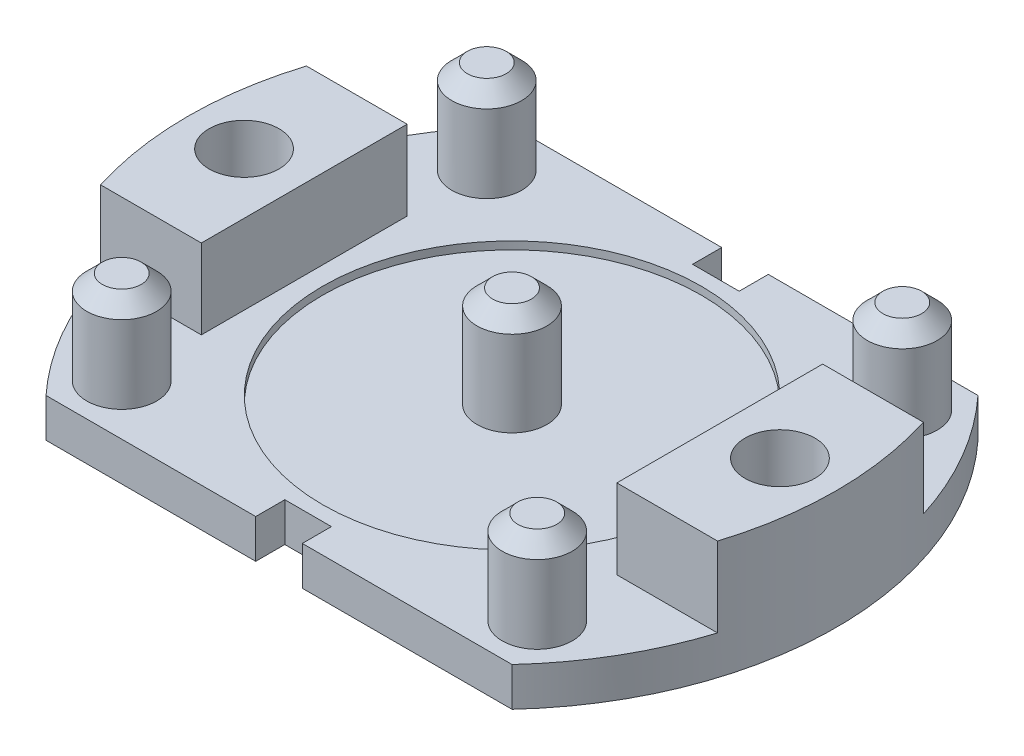
ISO-10303-21;
HEADER;
FILE_DESCRIPTION(('STEP AP214'),'2;1');
FILE_NAME('part.step','',(''),(''),'','','');
FILE_SCHEMA(('AUTOMOTIVE_DESIGN { 1 0 10303 214 1 1 1 1 }'));
ENDSEC;
DATA;
#1=APPLICATION_CONTEXT('core data for automotive mechanical design processes');
#2=APPLICATION_PROTOCOL_DEFINITION('international standard','automotive_design',2000,#1);
#3=PRODUCT_CONTEXT('',#1,'mechanical');
#4=PRODUCT('Part','Part','',(#3));
#5=PRODUCT_RELATED_PRODUCT_CATEGORY('part','',(#4));
#6=PRODUCT_DEFINITION_FORMATION('','',#4);
#7=PRODUCT_DEFINITION_CONTEXT('part definition',#1,'design');
#8=PRODUCT_DEFINITION('design','',#6,#7);
#9=PRODUCT_DEFINITION_SHAPE('','',#8);
#10=(LENGTH_UNIT() NAMED_UNIT(*) SI_UNIT(.MILLI.,.METRE.));
#11=(NAMED_UNIT(*) PLANE_ANGLE_UNIT() SI_UNIT($,.RADIAN.));
#12=(NAMED_UNIT(*) SI_UNIT($,.STERADIAN.) SOLID_ANGLE_UNIT());
#13=UNCERTAINTY_MEASURE_WITH_UNIT(LENGTH_MEASURE(1.E-05),#10,'distance_accuracy_value','');
#14=(GEOMETRIC_REPRESENTATION_CONTEXT(3) GLOBAL_UNCERTAINTY_ASSIGNED_CONTEXT((#13)) GLOBAL_UNIT_ASSIGNED_CONTEXT((#10,
#11,#12)) REPRESENTATION_CONTEXT('',''));
#15=CARTESIAN_POINT('',(0.,0.,0.));
#16=DIRECTION('',(0.,0.,1.));
#17=DIRECTION('',(1.,0.,0.));
#18=AXIS2_PLACEMENT_3D('',#15,#16,#17);
#19=CARTESIAN_POINT('',(0.48457447,1.,0.));
#20=DIRECTION('',(0.,-1.,0.));
#21=DIRECTION('',(0.,0.,-1.));
#22=AXIS2_PLACEMENT_3D('',#19,#20,#21);
#23=CYLINDRICAL_SURFACE('',#22,8.83457446949064);
#24=CARTESIAN_POINT('',(0.48457447,3.05,0.));
#25=DIRECTION('',(0.,1.,0.));
#26=DIRECTION('',(0.,0.,1.));
#27=AXIS2_PLACEMENT_3D('',#24,#25,#26);
#28=CIRCLE('',#27,8.83457446949064);
#29=CARTESIAN_POINT('',(-7.94318953102517,3.05,-2.65));
#30=VERTEX_POINT('',#29);
#31=CARTESIAN_POINT('',(-7.94318953102517,3.05,2.65));
#32=VERTEX_POINT('',#31);
#33=EDGE_CURVE('E202',#30,#32,#28,.T.);
#34=ORIENTED_EDGE('',*,*,#33,.F.);
#35=DIRECTION('',(0.,-1.,0.));
#36=VECTOR('',#35,1.);
#37=CARTESIAN_POINT('',(-7.94318953102517,3.4,-2.65));
#38=LINE('',#37,#36);
#39=CARTESIAN_POINT('',(-7.94318953102517,1.,-2.65));
#40=VERTEX_POINT('',#39);
#41=EDGE_CURVE('E200',#30,#40,#38,.T.);
#42=ORIENTED_EDGE('',*,*,#41,.T.);
#43=CARTESIAN_POINT('',(0.48457447,1.,0.));
#44=DIRECTION('',(0.,1.,0.));
#45=DIRECTION('',(0.,0.,1.));
#46=AXIS2_PLACEMENT_3D('',#43,#44,#45);
#47=CIRCLE('',#46,8.83457446949064);
#48=CARTESIAN_POINT('',(-5.99999999981541,1.,-6.0000000001995));
#49=VERTEX_POINT('',#48);
#50=EDGE_CURVE('E289',#49,#40,#47,.T.);
#51=ORIENTED_EDGE('',*,*,#50,.F.);
#52=DIRECTION('',(0.,-1.,0.));
#53=VECTOR('',#52,1.);
#54=CARTESIAN_POINT('',(-5.99999999981541,1.,-6.0000000001995));
#55=LINE('',#54,#53);
#56=CARTESIAN_POINT('',(-5.99999999981541,0.,-6.0000000001995));
#57=VERTEX_POINT('',#56);
#58=EDGE_CURVE('E404',#49,#57,#55,.T.);
#59=ORIENTED_EDGE('',*,*,#58,.T.);
#60=CARTESIAN_POINT('',(0.48457447,0.,0.));
#61=DIRECTION('',(0.,1.,0.));
#62=DIRECTION('',(0.,0.,1.));
#63=AXIS2_PLACEMENT_3D('',#60,#61,#62);
#64=CIRCLE('',#63,8.83457446949064);
#65=CARTESIAN_POINT('',(-6.,0.,6.));
#66=VERTEX_POINT('',#65);
#67=EDGE_CURVE('E329',#57,#66,#64,.T.);
#68=ORIENTED_EDGE('',*,*,#67,.T.);
#69=DIRECTION('',(0.,-1.,0.));
#70=VECTOR('',#69,1.);
#71=CARTESIAN_POINT('',(-6.,1.,6.));
#72=LINE('',#71,#70);
#73=CARTESIAN_POINT('',(-6.,1.,6.));
#74=VERTEX_POINT('',#73);
#75=EDGE_CURVE('E400',#74,#66,#72,.T.);
#76=ORIENTED_EDGE('',*,*,#75,.F.);
#77=CARTESIAN_POINT('',(-7.94318953102517,1.,2.65));
#78=VERTEX_POINT('',#77);
#79=EDGE_CURVE('E287',#78,#74,#47,.T.);
#80=ORIENTED_EDGE('',*,*,#79,.F.);
#81=DIRECTION('',(0.,-1.,0.));
#82=VECTOR('',#81,1.);
#83=CARTESIAN_POINT('',(-7.94318953102517,3.4,2.65));
#84=LINE('',#83,#82);
#85=EDGE_CURVE('E215',#32,#78,#84,.T.);
#86=ORIENTED_EDGE('',*,*,#85,.F.);
#87=EDGE_LOOP('',(#34,#42,#51,#59,#68,#76,#80,#86));
#88=FACE_BOUND('',#87,.T.);
#89=ADVANCED_FACE('F44',(#88),#23,.T.);
#90=CARTESIAN_POINT('',(-0.484574470509366,1.,0.));
#91=DIRECTION('',(0.,-1.,0.));
#92=DIRECTION('',(0.,0.,-1.));
#93=AXIS2_PLACEMENT_3D('',#90,#91,#92);
#94=CYLINDRICAL_SURFACE('',#93,8.83457447);
#95=CARTESIAN_POINT('',(-0.484574470509366,3.05,0.));
#96=DIRECTION('',(0.,1.,0.));
#97=DIRECTION('',(0.,0.,1.));
#98=AXIS2_PLACEMENT_3D('',#95,#96,#97);
#99=CIRCLE('',#98,8.83457447);
#100=CARTESIAN_POINT('',(7.94318953104976,3.05,2.65));
#101=VERTEX_POINT('',#100);
#102=CARTESIAN_POINT('',(7.94318953104976,3.05,-2.65));
#103=VERTEX_POINT('',#102);
#104=EDGE_CURVE('E458',#101,#103,#99,.T.);
#105=ORIENTED_EDGE('',*,*,#104,.F.);
#106=DIRECTION('',(0.,-1.,0.));
#107=VECTOR('',#106,1.);
#108=CARTESIAN_POINT('',(7.94318953104976,3.4,2.65));
#109=LINE('',#108,#107);
#110=CARTESIAN_POINT('',(7.94318953104976,1.,2.65));
#111=VERTEX_POINT('',#110);
#112=EDGE_CURVE('E232',#101,#111,#109,.T.);
#113=ORIENTED_EDGE('',*,*,#112,.T.);
#114=CARTESIAN_POINT('',(-0.484574470509366,1.,0.));
#115=DIRECTION('',(0.,1.,0.));
#116=DIRECTION('',(0.,0.,1.));
#117=AXIS2_PLACEMENT_3D('',#114,#115,#116);
#118=CIRCLE('',#117,8.83457447);
#119=CARTESIAN_POINT('',(6.,1.,6.0000000001995));
#120=VERTEX_POINT('',#119);
#121=EDGE_CURVE('E309',#120,#111,#118,.T.);
#122=ORIENTED_EDGE('',*,*,#121,.F.);
#123=DIRECTION('',(0.,-1.,0.));
#124=VECTOR('',#123,1.);
#125=CARTESIAN_POINT('',(6.,1.,6.0000000001995));
#126=LINE('',#125,#124);
#127=CARTESIAN_POINT('',(6.,0.,6.0000000001995));
#128=VERTEX_POINT('',#127);
#129=EDGE_CURVE('E380',#120,#128,#126,.T.);
#130=ORIENTED_EDGE('',*,*,#129,.T.);
#131=CARTESIAN_POINT('',(-0.484574470509366,0.,0.));
#132=DIRECTION('',(0.,1.,0.));
#133=DIRECTION('',(0.,0.,1.));
#134=AXIS2_PLACEMENT_3D('',#131,#132,#133);
#135=CIRCLE('',#134,8.83457447);
#136=CARTESIAN_POINT('',(6.00000000018459,0.,-6.));
#137=VERTEX_POINT('',#136);
#138=EDGE_CURVE('E347',#128,#137,#135,.T.);
#139=ORIENTED_EDGE('',*,*,#138,.T.);
#140=DIRECTION('',(0.,-1.,0.));
#141=VECTOR('',#140,1.);
#142=CARTESIAN_POINT('',(6.00000000018459,1.,-6.));
#143=LINE('',#142,#141);
#144=CARTESIAN_POINT('',(6.00000000018459,1.,-6.));
#145=VERTEX_POINT('',#144);
#146=EDGE_CURVE('E376',#145,#137,#143,.T.);
#147=ORIENTED_EDGE('',*,*,#146,.F.);
#148=CARTESIAN_POINT('',(7.94318953104976,1.,-2.65));
#149=VERTEX_POINT('',#148);
#150=EDGE_CURVE('E308',#149,#145,#118,.T.);
#151=ORIENTED_EDGE('',*,*,#150,.F.);
#152=DIRECTION('',(0.,-1.,0.));
#153=VECTOR('',#152,1.);
#154=CARTESIAN_POINT('',(7.94318953104976,3.4,-2.65));
#155=LINE('',#154,#153);
#156=EDGE_CURVE('E240',#103,#149,#155,.T.);
#157=ORIENTED_EDGE('',*,*,#156,.F.);
#158=EDGE_LOOP('',(#105,#113,#122,#130,#139,#147,#151,#157));
#159=FACE_BOUND('',#158,.T.);
#160=ADVANCED_FACE('F489',(#159),#94,.T.);
#161=CARTESIAN_POINT('',(5.35,3.4,2.65));
#162=DIRECTION('',(0.,0.,1.));
#163=DIRECTION('',(1.,0.,0.));
#164=AXIS2_PLACEMENT_3D('',#161,#162,#163);
#165=PLANE('',#164);
#166=ORIENTED_EDGE('',*,*,#112,.F.);
#167=DIRECTION('',(1.,0.,0.));
#168=VECTOR('',#167,1.);
#169=CARTESIAN_POINT('',(5.35,3.05,2.65));
#170=LINE('',#169,#168);
#171=CARTESIAN_POINT('',(5.35,3.05,2.65));
#172=VERTEX_POINT('',#171);
#173=EDGE_CURVE('E461',#172,#101,#170,.T.);
#174=ORIENTED_EDGE('',*,*,#173,.F.);
#175=DIRECTION('',(0.,-1.,0.));
#176=VECTOR('',#175,1.);
#177=CARTESIAN_POINT('',(5.35,3.4,2.65));
#178=LINE('',#177,#176);
#179=CARTESIAN_POINT('',(5.35,1.,2.65));
#180=VERTEX_POINT('',#179);
#181=EDGE_CURVE('E233',#172,#180,#178,.T.);
#182=ORIENTED_EDGE('',*,*,#181,.T.);
#183=DIRECTION('',(1.,0.,0.));
#184=VECTOR('',#183,1.);
#185=CARTESIAN_POINT('',(0.48457447,1.,2.65));
#186=LINE('',#185,#184);
#187=EDGE_CURVE('E252',#180,#111,#186,.T.);
#188=ORIENTED_EDGE('',*,*,#187,.T.);
#189=EDGE_LOOP('',(#166,#174,#182,#188));
#190=FACE_BOUND('',#189,.T.);
#191=ADVANCED_FACE('F495',(#190),#165,.T.);
#192=CARTESIAN_POINT('',(5.35,3.4,-2.65));
#193=DIRECTION('',(0.,0.,-1.));
#194=DIRECTION('',(-1.,0.,0.));
#195=AXIS2_PLACEMENT_3D('',#192,#193,#194);
#196=PLANE('',#195);
#197=DIRECTION('',(0.,-1.,0.));
#198=VECTOR('',#197,1.);
#199=CARTESIAN_POINT('',(5.35,3.4,-2.65));
#200=LINE('',#199,#198);
#201=CARTESIAN_POINT('',(5.35,3.05,-2.65));
#202=VERTEX_POINT('',#201);
#203=CARTESIAN_POINT('',(5.35,1.,-2.65));
#204=VERTEX_POINT('',#203);
#205=EDGE_CURVE('E237',#202,#204,#200,.T.);
#206=ORIENTED_EDGE('',*,*,#205,.F.);
#207=DIRECTION('',(-1.,0.,0.));
#208=VECTOR('',#207,1.);
#209=CARTESIAN_POINT('',(7.94318953104976,3.05,-2.65));
#210=LINE('',#209,#208);
#211=EDGE_CURVE('E63',#103,#202,#210,.T.);
#212=ORIENTED_EDGE('',*,*,#211,.F.);
#213=ORIENTED_EDGE('',*,*,#156,.T.);
#214=DIRECTION('',(-1.,0.,0.));
#215=VECTOR('',#214,1.);
#216=CARTESIAN_POINT('',(0.48457447,1.,-2.65));
#217=LINE('',#216,#215);
#218=EDGE_CURVE('E248',#149,#204,#217,.T.);
#219=ORIENTED_EDGE('',*,*,#218,.T.);
#220=EDGE_LOOP('',(#206,#212,#213,#219));
#221=FACE_BOUND('',#220,.T.);
#222=ADVANCED_FACE('F663',(#221),#196,.T.);
#223=CARTESIAN_POINT('',(5.35,3.4,2.65));
#224=DIRECTION('',(-1.,0.,0.));
#225=DIRECTION('',(0.,0.,1.));
#226=AXIS2_PLACEMENT_3D('',#223,#224,#225);
#227=PLANE('',#226);
#228=ORIENTED_EDGE('',*,*,#181,.F.);
#229=DIRECTION('',(0.,0.,1.));
#230=VECTOR('',#229,1.);
#231=CARTESIAN_POINT('',(5.35,3.05,-2.65));
#232=LINE('',#231,#230);
#233=EDGE_CURVE('E192',#202,#172,#232,.T.);
#234=ORIENTED_EDGE('',*,*,#233,.F.);
#235=ORIENTED_EDGE('',*,*,#205,.T.);
#236=DIRECTION('',(0.,0.,1.));
#237=VECTOR('',#236,1.);
#238=CARTESIAN_POINT('',(5.35,1.,0.));
#239=LINE('',#238,#237);
#240=EDGE_CURVE('E236',#204,#180,#239,.T.);
#241=ORIENTED_EDGE('',*,*,#240,.T.);
#242=EDGE_LOOP('',(#228,#234,#235,#241));
#243=FACE_BOUND('',#242,.T.);
#244=ADVANCED_FACE('F660',(#243),#227,.T.);
#245=CARTESIAN_POINT('',(-5.35,3.4,-2.65));
#246=DIRECTION('',(0.,0.,-1.));
#247=DIRECTION('',(-1.,0.,0.));
#248=AXIS2_PLACEMENT_3D('',#245,#246,#247);
#249=PLANE('',#248);
#250=ORIENTED_EDGE('',*,*,#41,.F.);
#251=DIRECTION('',(-1.,0.,0.));
#252=VECTOR('',#251,1.);
#253=CARTESIAN_POINT('',(-5.35,3.05,-2.65));
#254=LINE('',#253,#252);
#255=CARTESIAN_POINT('',(-5.35,3.05,-2.65));
#256=VERTEX_POINT('',#255);
#257=EDGE_CURVE('E186',#256,#30,#254,.T.);
#258=ORIENTED_EDGE('',*,*,#257,.F.);
#259=DIRECTION('',(0.,-1.,0.));
#260=VECTOR('',#259,1.);
#261=CARTESIAN_POINT('',(-5.35,3.4,-2.65));
#262=LINE('',#261,#260);
#263=CARTESIAN_POINT('',(-5.35,1.,-2.65));
#264=VERTEX_POINT('',#263);
#265=EDGE_CURVE('E198',#256,#264,#262,.T.);
#266=ORIENTED_EDGE('',*,*,#265,.T.);
#267=DIRECTION('',(-1.,0.,0.));
#268=VECTOR('',#267,1.);
#269=CARTESIAN_POINT('',(0.48457447,1.,-2.65));
#270=LINE('',#269,#268);
#271=EDGE_CURVE('E229',#264,#40,#270,.T.);
#272=ORIENTED_EDGE('',*,*,#271,.T.);
#273=EDGE_LOOP('',(#250,#258,#266,#272));
#274=FACE_BOUND('',#273,.T.);
#275=ADVANCED_FACE('F196',(#274),#249,.T.);
#276=CARTESIAN_POINT('',(-5.35,3.4,2.65));
#277=DIRECTION('',(0.,0.,1.));
#278=DIRECTION('',(1.,0.,0.));
#279=AXIS2_PLACEMENT_3D('',#276,#277,#278);
#280=PLANE('',#279);
#281=DIRECTION('',(0.,-1.,0.));
#282=VECTOR('',#281,1.);
#283=CARTESIAN_POINT('',(-5.35,3.4,2.65));
#284=LINE('',#283,#282);
#285=CARTESIAN_POINT('',(-5.35,3.05,2.65));
#286=VERTEX_POINT('',#285);
#287=CARTESIAN_POINT('',(-5.35,1.,2.65));
#288=VERTEX_POINT('',#287);
#289=EDGE_CURVE('E209',#286,#288,#284,.T.);
#290=ORIENTED_EDGE('',*,*,#289,.F.);
#291=DIRECTION('',(1.,0.,0.));
#292=VECTOR('',#291,1.);
#293=CARTESIAN_POINT('',(-7.94318953102517,3.05,2.65));
#294=LINE('',#293,#292);
#295=EDGE_CURVE('E71',#32,#286,#294,.T.);
#296=ORIENTED_EDGE('',*,*,#295,.F.);
#297=ORIENTED_EDGE('',*,*,#85,.T.);
#298=DIRECTION('',(1.,0.,0.));
#299=VECTOR('',#298,1.);
#300=CARTESIAN_POINT('',(0.48457447,1.,2.65));
#301=LINE('',#300,#299);
#302=EDGE_CURVE('E213',#78,#288,#301,.T.);
#303=ORIENTED_EDGE('',*,*,#302,.T.);
#304=EDGE_LOOP('',(#290,#296,#297,#303));
#305=FACE_BOUND('',#304,.T.);
#306=ADVANCED_FACE('F667',(#305),#280,.T.);
#307=CARTESIAN_POINT('',(-5.35,3.4,-2.65));
#308=DIRECTION('',(1.,0.,0.));
#309=DIRECTION('',(0.,0.,-1.));
#310=AXIS2_PLACEMENT_3D('',#307,#308,#309);
#311=PLANE('',#310);
#312=ORIENTED_EDGE('',*,*,#265,.F.);
#313=DIRECTION('',(0.,0.,-1.));
#314=VECTOR('',#313,1.);
#315=CARTESIAN_POINT('',(-5.35,3.05,2.65));
#316=LINE('',#315,#314);
#317=EDGE_CURVE('E182',#286,#256,#316,.T.);
#318=ORIENTED_EDGE('',*,*,#317,.F.);
#319=ORIENTED_EDGE('',*,*,#289,.T.);
#320=DIRECTION('',(0.,0.,-1.));
#321=VECTOR('',#320,1.);
#322=CARTESIAN_POINT('',(-5.35,1.,0.));
#323=LINE('',#322,#321);
#324=EDGE_CURVE('E207',#288,#264,#323,.T.);
#325=ORIENTED_EDGE('',*,*,#324,.T.);
#326=EDGE_LOOP('',(#312,#318,#319,#325));
#327=FACE_BOUND('',#326,.T.);
#328=ADVANCED_FACE('F205',(#327),#311,.T.);
#329=CARTESIAN_POINT('',(-0.599999999815409,1.,-6.00000000010972));
#330=DIRECTION('',(-1.66250758016207E-11,0.,1.));
#331=DIRECTION('',(1.,0.,1.66250758016207E-11));
#332=AXIS2_PLACEMENT_3D('',#329,#330,#331);
#333=PLANE('',#332);
#334=DIRECTION('',(-1.,0.,-1.66250758016207E-11));
#335=VECTOR('',#334,1.);
#336=CARTESIAN_POINT('',(-0.599999999815409,0.,-6.00000000010972));
#337=LINE('',#336,#335);
#338=CARTESIAN_POINT('',(-0.599999999815409,0.,-6.00000000010972));
#339=VERTEX_POINT('',#338);
#340=EDGE_CURVE('E279',#339,#57,#337,.T.);
#341=ORIENTED_EDGE('',*,*,#340,.T.);
#342=ORIENTED_EDGE('',*,*,#58,.F.);
#343=DIRECTION('',(-1.,0.,-1.66250758016207E-11));
#344=VECTOR('',#343,1.);
#345=CARTESIAN_POINT('',(-0.599999999815409,1.,-6.00000000010972));
#346=LINE('',#345,#344);
#347=CARTESIAN_POINT('',(-0.599999999815409,1.,-6.00000000010972));
#348=VERTEX_POINT('',#347);
#349=EDGE_CURVE('E283',#348,#49,#346,.T.);
#350=ORIENTED_EDGE('',*,*,#349,.F.);
#351=DIRECTION('',(0.,-1.,0.));
#352=VECTOR('',#351,1.);
#353=CARTESIAN_POINT('',(-0.599999999815409,1.,-6.00000000010972));
#354=LINE('',#353,#352);
#355=EDGE_CURVE('E325',#348,#339,#354,.T.);
#356=ORIENTED_EDGE('',*,*,#355,.T.);
#357=EDGE_LOOP('',(#341,#342,#350,#356));
#358=FACE_BOUND('',#357,.T.);
#359=ADVANCED_FACE('F502',(#358),#333,.F.);
#360=CARTESIAN_POINT('',(-6.,1.,6.));
#361=DIRECTION('',(1.66249151790766E-11,0.,-1.));
#362=DIRECTION('',(-1.,0.,-1.66249151790766E-11));
#363=AXIS2_PLACEMENT_3D('',#360,#361,#362);
#364=PLANE('',#363);
#365=DIRECTION('',(1.,0.,1.66249151790766E-11));
#366=VECTOR('',#365,1.);
#367=CARTESIAN_POINT('',(-6.,0.,6.));
#368=LINE('',#367,#366);
#369=CARTESIAN_POINT('',(-0.6,0.,6.00000000008978));
#370=VERTEX_POINT('',#369);
#371=EDGE_CURVE('E332',#66,#370,#368,.T.);
#372=ORIENTED_EDGE('',*,*,#371,.T.);
#373=DIRECTION('',(0.,-1.,0.));
#374=VECTOR('',#373,1.);
#375=CARTESIAN_POINT('',(-0.6,1.,6.00000000008978));
#376=LINE('',#375,#374);
#377=CARTESIAN_POINT('',(-0.6,1.,6.00000000008978));
#378=VERTEX_POINT('',#377);
#379=EDGE_CURVE('E396',#378,#370,#376,.T.);
#380=ORIENTED_EDGE('',*,*,#379,.F.);
#381=DIRECTION('',(1.,0.,1.66249151790766E-11));
#382=VECTOR('',#381,1.);
#383=CARTESIAN_POINT('',(-6.,1.,6.));
#384=LINE('',#383,#382);
#385=EDGE_CURVE('E293',#74,#378,#384,.T.);
#386=ORIENTED_EDGE('',*,*,#385,.F.);
#387=ORIENTED_EDGE('',*,*,#75,.T.);
#388=EDGE_LOOP('',(#372,#380,#386,#387));
#389=FACE_BOUND('',#388,.T.);
#390=ADVANCED_FACE('F500',(#389),#364,.F.);
#391=CARTESIAN_POINT('',(-0.6,1.,6.00000000008978));
#392=DIRECTION('',(-1.,0.,0.));
#393=DIRECTION('',(0.,0.,1.));
#394=AXIS2_PLACEMENT_3D('',#391,#392,#393);
#395=PLANE('',#394);
#396=DIRECTION('',(0.,0.,-1.));
#397=VECTOR('',#396,1.);
#398=CARTESIAN_POINT('',(-0.6,0.,6.00000000008978));
#399=LINE('',#398,#397);
#400=CARTESIAN_POINT('',(-0.6,0.,5.25000000010973));
#401=VERTEX_POINT('',#400);
#402=EDGE_CURVE('E335',#370,#401,#399,.T.);
#403=ORIENTED_EDGE('',*,*,#402,.T.);
#404=DIRECTION('',(0.,-1.,0.));
#405=VECTOR('',#404,1.);
#406=CARTESIAN_POINT('',(-0.6,1.,5.25000000010973));
#407=LINE('',#406,#405);
#408=CARTESIAN_POINT('',(-0.6,1.,5.25000000010973));
#409=VERTEX_POINT('',#408);
#410=EDGE_CURVE('E392',#409,#401,#407,.T.);
#411=ORIENTED_EDGE('',*,*,#410,.F.);
#412=DIRECTION('',(0.,0.,-1.));
#413=VECTOR('',#412,1.);
#414=CARTESIAN_POINT('',(-0.6,1.,6.00000000008978));
#415=LINE('',#414,#413);
#416=EDGE_CURVE('E296',#378,#409,#415,.T.);
#417=ORIENTED_EDGE('',*,*,#416,.F.);
#418=ORIENTED_EDGE('',*,*,#379,.T.);
#419=EDGE_LOOP('',(#403,#411,#417,#418));
#420=FACE_BOUND('',#419,.T.);
#421=ADVANCED_FACE('F604',(#420),#395,.F.);
#422=CARTESIAN_POINT('',(-0.6,1.,5.25000000010973));
#423=DIRECTION('',(0.,0.,-1.));
#424=DIRECTION('',(-1.,0.,0.));
#425=AXIS2_PLACEMENT_3D('',#422,#423,#424);
#426=PLANE('',#425);
#427=DIRECTION('',(1.,0.,0.));
#428=VECTOR('',#427,1.);
#429=CARTESIAN_POINT('',(-0.6,0.,5.25000000010973));
#430=LINE('',#429,#428);
#431=CARTESIAN_POINT('',(0.6,0.,5.25000000010973));
#432=VERTEX_POINT('',#431);
#433=EDGE_CURVE('E338',#401,#432,#430,.T.);
#434=ORIENTED_EDGE('',*,*,#433,.T.);
#435=DIRECTION('',(0.,-1.,0.));
#436=VECTOR('',#435,1.);
#437=CARTESIAN_POINT('',(0.6,1.,5.25000000010973));
#438=LINE('',#437,#436);
#439=CARTESIAN_POINT('',(0.6,1.,5.25000000010973));
#440=VERTEX_POINT('',#439);
#441=EDGE_CURVE('E388',#440,#432,#438,.T.);
#442=ORIENTED_EDGE('',*,*,#441,.F.);
#443=DIRECTION('',(1.,0.,0.));
#444=VECTOR('',#443,1.);
#445=CARTESIAN_POINT('',(-0.6,1.,5.25000000010973));
#446=LINE('',#445,#444);
#447=EDGE_CURVE('E299',#409,#440,#446,.T.);
#448=ORIENTED_EDGE('',*,*,#447,.F.);
#449=ORIENTED_EDGE('',*,*,#410,.T.);
#450=EDGE_LOOP('',(#434,#442,#448,#449));
#451=FACE_BOUND('',#450,.T.);
#452=ADVANCED_FACE('F601',(#451),#426,.F.);
#453=CARTESIAN_POINT('',(0.6,1.,5.25000000010973));
#454=DIRECTION('',(1.,0.,0.));
#455=DIRECTION('',(0.,0.,-1.));
#456=AXIS2_PLACEMENT_3D('',#453,#454,#455);
#457=PLANE('',#456);
#458=DIRECTION('',(0.,0.,1.));
#459=VECTOR('',#458,1.);
#460=CARTESIAN_POINT('',(0.6,0.,5.25000000010973));
#461=LINE('',#460,#459);
#462=CARTESIAN_POINT('',(0.6,0.,6.00000000010972));
#463=VERTEX_POINT('',#462);
#464=EDGE_CURVE('E341',#432,#463,#461,.T.);
#465=ORIENTED_EDGE('',*,*,#464,.T.);
#466=DIRECTION('',(0.,-1.,0.));
#467=VECTOR('',#466,1.);
#468=CARTESIAN_POINT('',(0.6,1.,6.00000000010972));
#469=LINE('',#468,#467);
#470=CARTESIAN_POINT('',(0.6,1.,6.00000000010972));
#471=VERTEX_POINT('',#470);
#472=EDGE_CURVE('E384',#471,#463,#469,.T.);
#473=ORIENTED_EDGE('',*,*,#472,.F.);
#474=DIRECTION('',(0.,0.,1.));
#475=VECTOR('',#474,1.);
#476=CARTESIAN_POINT('',(0.6,1.,5.25000000010973));
#477=LINE('',#476,#475);
#478=EDGE_CURVE('E302',#440,#471,#477,.T.);
#479=ORIENTED_EDGE('',*,*,#478,.F.);
#480=ORIENTED_EDGE('',*,*,#441,.T.);
#481=EDGE_LOOP('',(#465,#473,#479,#480));
#482=FACE_BOUND('',#481,.T.);
#483=ADVANCED_FACE('F597',(#482),#457,.F.);
#484=CARTESIAN_POINT('',(0.6,1.,6.00000000010972));
#485=DIRECTION('',(1.66250758016207E-11,0.,-1.));
#486=DIRECTION('',(-1.,0.,-1.66250758016207E-11));
#487=AXIS2_PLACEMENT_3D('',#484,#485,#486);
#488=PLANE('',#487);
#489=DIRECTION('',(1.,0.,1.66250758016207E-11));
#490=VECTOR('',#489,1.);
#491=CARTESIAN_POINT('',(0.6,0.,6.00000000010972));
#492=LINE('',#491,#490);
#493=EDGE_CURVE('E344',#463,#128,#492,.T.);
#494=ORIENTED_EDGE('',*,*,#493,.T.);
#495=ORIENTED_EDGE('',*,*,#129,.F.);
#496=DIRECTION('',(1.,0.,1.66250758016207E-11));
#497=VECTOR('',#496,1.);
#498=CARTESIAN_POINT('',(0.6,1.,6.00000000010972));
#499=LINE('',#498,#497);
#500=EDGE_CURVE('E305',#471,#120,#499,.T.);
#501=ORIENTED_EDGE('',*,*,#500,.F.);
#502=ORIENTED_EDGE('',*,*,#472,.T.);
#503=EDGE_LOOP('',(#494,#495,#501,#502));
#504=FACE_BOUND('',#503,.T.);
#505=ADVANCED_FACE('F592',(#504),#488,.F.);
#506=CARTESIAN_POINT('',(6.00000000018459,1.,-6.));
#507=DIRECTION('',(-1.66245939339885E-11,0.,1.));
#508=DIRECTION('',(1.,0.,1.66245939339885E-11));
#509=AXIS2_PLACEMENT_3D('',#506,#507,#508);
#510=PLANE('',#509);
#511=DIRECTION('',(-1.,0.,-1.66245939339885E-11));
#512=VECTOR('',#511,1.);
#513=CARTESIAN_POINT('',(6.00000000018459,0.,-6.));
#514=LINE('',#513,#512);
#515=CARTESIAN_POINT('',(0.600000000184591,0.,-6.00000000008977));
#516=VERTEX_POINT('',#515);
#517=EDGE_CURVE('E350',#137,#516,#514,.T.);
#518=ORIENTED_EDGE('',*,*,#517,.T.);
#519=DIRECTION('',(0.,-1.,0.));
#520=VECTOR('',#519,1.);
#521=CARTESIAN_POINT('',(0.600000000184591,1.,-6.00000000008977));
#522=LINE('',#521,#520);
#523=CARTESIAN_POINT('',(0.600000000184591,1.,-6.00000000008977));
#524=VERTEX_POINT('',#523);
#525=EDGE_CURVE('E372',#524,#516,#522,.T.);
#526=ORIENTED_EDGE('',*,*,#525,.F.);
#527=DIRECTION('',(-1.,0.,-1.66245939339885E-11));
#528=VECTOR('',#527,1.);
#529=CARTESIAN_POINT('',(6.00000000018459,1.,-6.));
#530=LINE('',#529,#528);
#531=EDGE_CURVE('E313',#145,#524,#530,.T.);
#532=ORIENTED_EDGE('',*,*,#531,.F.);
#533=ORIENTED_EDGE('',*,*,#146,.T.);
#534=EDGE_LOOP('',(#518,#526,#532,#533));
#535=FACE_BOUND('',#534,.T.);
#536=ADVANCED_FACE('F589',(#535),#510,.F.);
#537=CARTESIAN_POINT('',(0.600000000184591,1.,-5.25000000008977));
#538=DIRECTION('',(1.,0.,0.));
#539=DIRECTION('',(0.,0.,-1.));
#540=AXIS2_PLACEMENT_3D('',#537,#538,#539);
#541=PLANE('',#540);
#542=DIRECTION('',(0.,0.,1.));
#543=VECTOR('',#542,1.);
#544=CARTESIAN_POINT('',(0.600000000184591,0.,-5.25000000008977));
#545=LINE('',#544,#543);
#546=CARTESIAN_POINT('',(0.600000000184591,0.,-5.25000000008977));
#547=VERTEX_POINT('',#546);
#548=EDGE_CURVE('E353',#516,#547,#545,.T.);
#549=ORIENTED_EDGE('',*,*,#548,.T.);
#550=DIRECTION('',(0.,-1.,0.));
#551=VECTOR('',#550,1.);
#552=CARTESIAN_POINT('',(0.600000000184591,1.,-5.25000000008977));
#553=LINE('',#552,#551);
#554=CARTESIAN_POINT('',(0.600000000184591,1.,-5.25000000008977));
#555=VERTEX_POINT('',#554);
#556=EDGE_CURVE('E368',#555,#547,#553,.T.);
#557=ORIENTED_EDGE('',*,*,#556,.F.);
#558=DIRECTION('',(0.,0.,1.));
#559=VECTOR('',#558,1.);
#560=CARTESIAN_POINT('',(0.600000000184591,1.,-5.25000000008977));
#561=LINE('',#560,#559);
#562=EDGE_CURVE('E316',#524,#555,#561,.T.);
#563=ORIENTED_EDGE('',*,*,#562,.F.);
#564=ORIENTED_EDGE('',*,*,#525,.T.);
#565=EDGE_LOOP('',(#549,#557,#563,#564));
#566=FACE_BOUND('',#565,.T.);
#567=ADVANCED_FACE('F585',(#566),#541,.F.);
#568=CARTESIAN_POINT('',(-0.599999999815408,1.,-5.25000000008978));
#569=DIRECTION('',(0.,0.,1.));
#570=DIRECTION('',(1.,0.,0.));
#571=AXIS2_PLACEMENT_3D('',#568,#569,#570);
#572=PLANE('',#571);
#573=DIRECTION('',(-1.,0.,0.));
#574=VECTOR('',#573,1.);
#575=CARTESIAN_POINT('',(-0.599999999815408,0.,-5.25000000008978));
#576=LINE('',#575,#574);
#577=CARTESIAN_POINT('',(-0.599999999815408,0.,-5.25000000008978));
#578=VERTEX_POINT('',#577);
#579=EDGE_CURVE('E356',#547,#578,#576,.T.);
#580=ORIENTED_EDGE('',*,*,#579,.T.);
#581=DIRECTION('',(0.,-1.,0.));
#582=VECTOR('',#581,1.);
#583=CARTESIAN_POINT('',(-0.599999999815408,1.,-5.25000000008978));
#584=LINE('',#583,#582);
#585=CARTESIAN_POINT('',(-0.599999999815408,1.,-5.25000000008978));
#586=VERTEX_POINT('',#585);
#587=EDGE_CURVE('E364',#586,#578,#584,.T.);
#588=ORIENTED_EDGE('',*,*,#587,.F.);
#589=DIRECTION('',(-1.,0.,0.));
#590=VECTOR('',#589,1.);
#591=CARTESIAN_POINT('',(-0.599999999815408,1.,-5.25000000008978));
#592=LINE('',#591,#590);
#593=EDGE_CURVE('E319',#555,#586,#592,.T.);
#594=ORIENTED_EDGE('',*,*,#593,.F.);
#595=ORIENTED_EDGE('',*,*,#556,.T.);
#596=EDGE_LOOP('',(#580,#588,#594,#595));
#597=FACE_BOUND('',#596,.T.);
#598=ADVANCED_FACE('F581',(#597),#572,.F.);
#599=CARTESIAN_POINT('',(-0.599999999815409,1.,-6.00000000010972));
#600=DIRECTION('',(-1.,0.,0.));
#601=DIRECTION('',(0.,0.,1.));
#602=AXIS2_PLACEMENT_3D('',#599,#600,#601);
#603=PLANE('',#602);
#604=DIRECTION('',(0.,0.,-1.));
#605=VECTOR('',#604,1.);
#606=CARTESIAN_POINT('',(-0.599999999815409,0.,-6.00000000010972));
#607=LINE('',#606,#605);
#608=EDGE_CURVE('E288',#578,#339,#607,.T.);
#609=ORIENTED_EDGE('',*,*,#608,.T.);
#610=ORIENTED_EDGE('',*,*,#355,.F.);
#611=DIRECTION('',(0.,0.,-1.));
#612=VECTOR('',#611,1.);
#613=CARTESIAN_POINT('',(-0.599999999815409,1.,-6.00000000010972));
#614=LINE('',#613,#612);
#615=EDGE_CURVE('E322',#586,#348,#614,.T.);
#616=ORIENTED_EDGE('',*,*,#615,.F.);
#617=ORIENTED_EDGE('',*,*,#587,.T.);
#618=EDGE_LOOP('',(#609,#610,#616,#617));
#619=FACE_BOUND('',#618,.T.);
#620=ADVANCED_FACE('F553',(#619),#603,.F.);
#621=CARTESIAN_POINT('',(0.48457447,1.,0.));
#622=DIRECTION('',(0.,1.,0.));
#623=DIRECTION('',(0.,0.,1.));
#624=AXIS2_PLACEMENT_3D('',#621,#622,#623);
#625=PLANE('',#624);
#626=ORIENTED_EDGE('',*,*,#271,.F.);
#627=ORIENTED_EDGE('',*,*,#324,.F.);
#628=ORIENTED_EDGE('',*,*,#302,.F.);
#629=ORIENTED_EDGE('',*,*,#79,.T.);
#630=ORIENTED_EDGE('',*,*,#385,.T.);
#631=ORIENTED_EDGE('',*,*,#416,.T.);
#632=ORIENTED_EDGE('',*,*,#447,.T.);
#633=ORIENTED_EDGE('',*,*,#478,.T.);
#634=ORIENTED_EDGE('',*,*,#500,.T.);
#635=ORIENTED_EDGE('',*,*,#121,.T.);
#636=ORIENTED_EDGE('',*,*,#187,.F.);
#637=ORIENTED_EDGE('',*,*,#240,.F.);
#638=ORIENTED_EDGE('',*,*,#218,.F.);
#639=ORIENTED_EDGE('',*,*,#150,.T.);
#640=ORIENTED_EDGE('',*,*,#531,.T.);
#641=ORIENTED_EDGE('',*,*,#562,.T.);
#642=ORIENTED_EDGE('',*,*,#593,.T.);
#643=ORIENTED_EDGE('',*,*,#615,.T.);
#644=ORIENTED_EDGE('',*,*,#349,.T.);
#645=ORIENTED_EDGE('',*,*,#50,.T.);
#646=EDGE_LOOP('',(#626,#627,#628,#629,#630,#631,#632,#633,#634,#635,#636,#637,#638,#639,#640,
#641,#642,#643,#644,#645));
#647=FACE_BOUND('',#646,.T.);
#648=CARTESIAN_POINT('',(5.35,1.,-4.7000000001995));
#649=DIRECTION('',(0.,1.,0.));
#650=DIRECTION('',(0.,0.,1.));
#651=AXIS2_PLACEMENT_3D('',#648,#649,#650);
#652=CIRCLE('',#651,0.899999999999999);
#653=CARTESIAN_POINT('',(5.35,1.,-3.8000000001995));
#654=VERTEX_POINT('',#653);
#655=EDGE_CURVE('E257',#654,#654,#652,.T.);
#656=ORIENTED_EDGE('',*,*,#655,.F.);
#657=EDGE_LOOP('',(#656));
#658=FACE_BOUND('',#657,.T.);
#659=CARTESIAN_POINT('',(-5.34999999981541,1.,-4.7000000001995));
#660=DIRECTION('',(0.,1.,0.));
#661=DIRECTION('',(0.,0.,1.));
#662=AXIS2_PLACEMENT_3D('',#659,#660,#661);
#663=CIRCLE('',#662,0.899999999999999);
#664=CARTESIAN_POINT('',(-5.34999999981541,1.,-3.8000000001995));
#665=VERTEX_POINT('',#664);
#666=EDGE_CURVE('E262',#665,#665,#663,.T.);
#667=ORIENTED_EDGE('',*,*,#666,.F.);
#668=EDGE_LOOP('',(#667));
#669=FACE_BOUND('',#668,.T.);
#670=CARTESIAN_POINT('',(5.35,1.,4.7));
#671=DIRECTION('',(0.,1.,0.));
#672=DIRECTION('',(0.,0.,1.));
#673=AXIS2_PLACEMENT_3D('',#670,#671,#672);
#674=CIRCLE('',#673,0.899999999999999);
#675=CARTESIAN_POINT('',(5.35,1.,5.6));
#676=VERTEX_POINT('',#675);
#677=EDGE_CURVE('E266',#676,#676,#674,.T.);
#678=ORIENTED_EDGE('',*,*,#677,.F.);
#679=EDGE_LOOP('',(#678));
#680=FACE_BOUND('',#679,.T.);
#681=CARTESIAN_POINT('',(-5.35,1.,4.7));
#682=DIRECTION('',(0.,1.,0.));
#683=DIRECTION('',(0.,0.,1.));
#684=AXIS2_PLACEMENT_3D('',#681,#682,#683);
#685=CIRCLE('',#684,0.899999999999999);
#686=CARTESIAN_POINT('',(-5.35,1.,5.6));
#687=VERTEX_POINT('',#686);
#688=EDGE_CURVE('E270',#687,#687,#685,.T.);
#689=ORIENTED_EDGE('',*,*,#688,.F.);
#690=EDGE_LOOP('',(#689));
#691=FACE_BOUND('',#690,.T.);
#692=CARTESIAN_POINT('',(0.,1.,0.));
#693=DIRECTION('',(0.,1.,0.));
#694=DIRECTION('',(0.,0.,1.));
#695=AXIS2_PLACEMENT_3D('',#692,#693,#694);
#696=CIRCLE('',#695,4.875);
#697=CARTESIAN_POINT('',(0.,1.,4.875));
#698=VERTEX_POINT('',#697);
#699=EDGE_CURVE('E256',#698,#698,#696,.T.);
#700=ORIENTED_EDGE('',*,*,#699,.F.);
#701=EDGE_LOOP('',(#700));
#702=FACE_BOUND('',#701,.T.);
#703=ADVANCED_FACE('F549',(#647,#658,#669,#680,#691,#702),#625,.T.);
#704=CARTESIAN_POINT('',(0.48457447,0.,0.));
#705=DIRECTION('',(0.,1.,0.));
#706=DIRECTION('',(0.,0.,1.));
#707=AXIS2_PLACEMENT_3D('',#704,#705,#706);
#708=PLANE('',#707);
#709=ORIENTED_EDGE('',*,*,#371,.F.);
#710=ORIENTED_EDGE('',*,*,#67,.F.);
#711=ORIENTED_EDGE('',*,*,#340,.F.);
#712=ORIENTED_EDGE('',*,*,#608,.F.);
#713=ORIENTED_EDGE('',*,*,#579,.F.);
#714=ORIENTED_EDGE('',*,*,#548,.F.);
#715=ORIENTED_EDGE('',*,*,#517,.F.);
#716=ORIENTED_EDGE('',*,*,#138,.F.);
#717=ORIENTED_EDGE('',*,*,#493,.F.);
#718=ORIENTED_EDGE('',*,*,#464,.F.);
#719=ORIENTED_EDGE('',*,*,#433,.F.);
#720=ORIENTED_EDGE('',*,*,#402,.F.);
#721=EDGE_LOOP('',(#709,#710,#711,#712,#713,#714,#715,#716,#717,#718,#719,#720));
#722=FACE_BOUND('',#721,.T.);
#723=ADVANCED_FACE('F552',(#722),#708,.F.);
#724=CARTESIAN_POINT('',(0.,0.8,0.));
#725=DIRECTION('',(0.,1.,0.));
#726=DIRECTION('',(0.,0.,1.));
#727=AXIS2_PLACEMENT_3D('',#724,#725,#726);
#728=CYLINDRICAL_SURFACE('',#727,4.875);
#729=CARTESIAN_POINT('',(0.,0.8,0.));
#730=DIRECTION('',(0.,1.,0.));
#731=DIRECTION('',(0.,0.,1.));
#732=AXIS2_PLACEMENT_3D('',#729,#730,#731);
#733=CIRCLE('',#732,4.875);
#734=CARTESIAN_POINT('',(0.,0.8,4.875));
#735=VERTEX_POINT('',#734);
#736=EDGE_CURVE('E275',#735,#735,#733,.T.);
#737=ORIENTED_EDGE('',*,*,#736,.F.);
#738=EDGE_LOOP('',(#737));
#739=FACE_BOUND('',#738,.T.);
#740=ORIENTED_EDGE('',*,*,#699,.T.);
#741=EDGE_LOOP('',(#740));
#742=FACE_BOUND('',#741,.T.);
#743=ADVANCED_FACE('F562',(#739,#742),#728,.F.);
#744=CARTESIAN_POINT('',(0.,0.8,0.));
#745=DIRECTION('',(0.,1.,0.));
#746=DIRECTION('',(0.,0.,1.));
#747=AXIS2_PLACEMENT_3D('',#744,#745,#746);
#748=PLANE('',#747);
#749=CARTESIAN_POINT('',(0.,0.8,0.));
#750=DIRECTION('',(0.,1.,0.));
#751=DIRECTION('',(0.,0.,1.));
#752=AXIS2_PLACEMENT_3D('',#749,#750,#751);
#753=CIRCLE('',#752,0.9);
#754=CARTESIAN_POINT('',(0.,0.8,0.9));
#755=VERTEX_POINT('',#754);
#756=EDGE_CURVE('E274',#755,#755,#753,.T.);
#757=ORIENTED_EDGE('',*,*,#756,.F.);
#758=EDGE_LOOP('',(#757));
#759=FACE_BOUND('',#758,.T.);
#760=ORIENTED_EDGE('',*,*,#736,.T.);
#761=EDGE_LOOP('',(#760));
#762=FACE_BOUND('',#761,.T.);
#763=ADVANCED_FACE('F564',(#759,#762),#748,.T.);
#764=CARTESIAN_POINT('',(0.,3.4,0.));
#765=DIRECTION('',(0.,-1.,0.));
#766=DIRECTION('',(0.,0.,-1.));
#767=AXIS2_PLACEMENT_3D('',#764,#765,#766);
#768=CYLINDRICAL_SURFACE('',#767,0.9);
#769=CARTESIAN_POINT('',(0.,3.,0.));
#770=DIRECTION('',(0.,-1.,0.));
#771=DIRECTION('',(0.,0.,-1.));
#772=AXIS2_PLACEMENT_3D('',#769,#770,#771);
#773=CIRCLE('',#772,0.9);
#774=CARTESIAN_POINT('',(0.,3.,-0.9));
#775=VERTEX_POINT('',#774);
#776=EDGE_CURVE('E55',#775,#775,#773,.T.);
#777=ORIENTED_EDGE('',*,*,#776,.T.);
#778=EDGE_LOOP('',(#777));
#779=FACE_BOUND('',#778,.T.);
#780=ORIENTED_EDGE('',*,*,#756,.T.);
#781=EDGE_LOOP('',(#780));
#782=FACE_BOUND('',#781,.T.);
#783=ADVANCED_FACE('F571',(#779,#782),#768,.T.);
#784=CARTESIAN_POINT('',(0.,3.4,0.));
#785=DIRECTION('',(0.,-1.,0.));
#786=DIRECTION('',(0.,0.,-1.));
#787=AXIS2_PLACEMENT_3D('',#784,#785,#786);
#788=PLANE('',#787);
#789=CARTESIAN_POINT('',(0.,3.4,0.));
#790=DIRECTION('',(0.,-1.,0.));
#791=DIRECTION('',(0.,0.,-1.));
#792=AXIS2_PLACEMENT_3D('',#789,#790,#791);
#793=CIRCLE('',#792,0.499999999999995);
#794=CARTESIAN_POINT('',(0.,3.4,-0.499999999999995));
#795=VERTEX_POINT('',#794);
#796=EDGE_CURVE('E11',#795,#795,#793,.F.);
#797=ORIENTED_EDGE('',*,*,#796,.T.);
#798=EDGE_LOOP('',(#797));
#799=FACE_BOUND('',#798,.T.);
#800=ADVANCED_FACE('F704',(#799),#788,.F.);
#801=CARTESIAN_POINT('',(-5.35,3.4,4.7));
#802=DIRECTION('',(0.,-1.,0.));
#803=DIRECTION('',(0.,0.,-1.));
#804=AXIS2_PLACEMENT_3D('',#801,#802,#803);
#805=CYLINDRICAL_SURFACE('',#804,0.899999999999999);
#806=CARTESIAN_POINT('',(-5.35,3.,4.7));
#807=DIRECTION('',(0.,-1.,0.));
#808=DIRECTION('',(0.,0.,-1.));
#809=AXIS2_PLACEMENT_3D('',#806,#807,#808);
#810=CIRCLE('',#809,0.899999999999999);
#811=CARTESIAN_POINT('',(-5.35,3.,3.8));
#812=VERTEX_POINT('',#811);
#813=EDGE_CURVE('E418',#812,#812,#810,.T.);
#814=ORIENTED_EDGE('',*,*,#813,.T.);
#815=EDGE_LOOP('',(#814));
#816=FACE_BOUND('',#815,.T.);
#817=ORIENTED_EDGE('',*,*,#688,.T.);
#818=EDGE_LOOP('',(#817));
#819=FACE_BOUND('',#818,.T.);
#820=ADVANCED_FACE('F701',(#816,#819),#805,.T.);
#821=CARTESIAN_POINT('',(-5.35,3.4,4.7));
#822=DIRECTION('',(0.,-1.,0.));
#823=DIRECTION('',(0.,0.,-1.));
#824=AXIS2_PLACEMENT_3D('',#821,#822,#823);
#825=PLANE('',#824);
#826=CARTESIAN_POINT('',(-5.35,3.4,4.7));
#827=DIRECTION('',(0.,-1.,0.));
#828=DIRECTION('',(0.,0.,-1.));
#829=AXIS2_PLACEMENT_3D('',#826,#827,#828);
#830=CIRCLE('',#829,0.499999999999995);
#831=CARTESIAN_POINT('',(-5.35,3.4,4.20000000000001));
#832=VERTEX_POINT('',#831);
#833=EDGE_CURVE('E422',#832,#832,#830,.F.);
#834=ORIENTED_EDGE('',*,*,#833,.T.);
#835=EDGE_LOOP('',(#834));
#836=FACE_BOUND('',#835,.T.);
#837=ADVANCED_FACE('F696',(#836),#825,.F.);
#838=CARTESIAN_POINT('',(5.35,3.4,4.7));
#839=DIRECTION('',(0.,-1.,0.));
#840=DIRECTION('',(0.,0.,-1.));
#841=AXIS2_PLACEMENT_3D('',#838,#839,#840);
#842=CYLINDRICAL_SURFACE('',#841,0.899999999999999);
#843=CARTESIAN_POINT('',(5.35,3.,4.7));
#844=DIRECTION('',(0.,-1.,0.));
#845=DIRECTION('',(0.,0.,-1.));
#846=AXIS2_PLACEMENT_3D('',#843,#844,#845);
#847=CIRCLE('',#846,0.899999999999999);
#848=CARTESIAN_POINT('',(5.35,3.,3.8));
#849=VERTEX_POINT('',#848);
#850=EDGE_CURVE('E261',#849,#849,#847,.T.);
#851=ORIENTED_EDGE('',*,*,#850,.T.);
#852=EDGE_LOOP('',(#851));
#853=FACE_BOUND('',#852,.T.);
#854=ORIENTED_EDGE('',*,*,#677,.T.);
#855=EDGE_LOOP('',(#854));
#856=FACE_BOUND('',#855,.T.);
#857=ADVANCED_FACE('F693',(#853,#856),#842,.T.);
#858=CARTESIAN_POINT('',(5.35,3.4,4.7));
#859=DIRECTION('',(0.,-1.,0.));
#860=DIRECTION('',(0.,0.,-1.));
#861=AXIS2_PLACEMENT_3D('',#858,#859,#860);
#862=PLANE('',#861);
#863=CARTESIAN_POINT('',(5.35,3.4,4.7));
#864=DIRECTION('',(0.,-1.,0.));
#865=DIRECTION('',(0.,0.,-1.));
#866=AXIS2_PLACEMENT_3D('',#863,#864,#865);
#867=CIRCLE('',#866,0.499999999999995);
#868=CARTESIAN_POINT('',(5.35,3.4,4.20000000000001));
#869=VERTEX_POINT('',#868);
#870=EDGE_CURVE('E414',#869,#869,#867,.F.);
#871=ORIENTED_EDGE('',*,*,#870,.T.);
#872=EDGE_LOOP('',(#871));
#873=FACE_BOUND('',#872,.T.);
#874=ADVANCED_FACE('F545',(#873),#862,.F.);
#875=CARTESIAN_POINT('',(-5.34999999981541,3.4,-4.7000000001995));
#876=DIRECTION('',(0.,-1.,0.));
#877=DIRECTION('',(0.,0.,-1.));
#878=AXIS2_PLACEMENT_3D('',#875,#876,#877);
#879=CYLINDRICAL_SURFACE('',#878,0.899999999999999);
#880=CARTESIAN_POINT('',(-5.34999999981541,3.,-4.7000000001995));
#881=DIRECTION('',(0.,-1.,0.));
#882=DIRECTION('',(0.,0.,-1.));
#883=AXIS2_PLACEMENT_3D('',#880,#881,#882);
#884=CIRCLE('',#883,0.899999999999999);
#885=CARTESIAN_POINT('',(-5.34999999981541,3.,-5.6000000001995));
#886=VERTEX_POINT('',#885);
#887=EDGE_CURVE('E434',#886,#886,#884,.T.);
#888=ORIENTED_EDGE('',*,*,#887,.T.);
#889=EDGE_LOOP('',(#888));
#890=FACE_BOUND('',#889,.T.);
#891=ORIENTED_EDGE('',*,*,#666,.T.);
#892=EDGE_LOOP('',(#891));
#893=FACE_BOUND('',#892,.T.);
#894=ADVANCED_FACE('F541',(#890,#893),#879,.T.);
#895=CARTESIAN_POINT('',(-5.34999999981541,3.4,-4.7000000001995));
#896=DIRECTION('',(0.,-1.,0.));
#897=DIRECTION('',(0.,0.,-1.));
#898=AXIS2_PLACEMENT_3D('',#895,#896,#897);
#899=PLANE('',#898);
#900=CARTESIAN_POINT('',(-5.34999999981541,3.4,-4.7000000001995));
#901=DIRECTION('',(0.,-1.,0.));
#902=DIRECTION('',(0.,0.,-1.));
#903=AXIS2_PLACEMENT_3D('',#900,#901,#902);
#904=CIRCLE('',#903,0.499999999999995);
#905=CARTESIAN_POINT('',(-5.34999999981541,3.4,-5.2000000001995));
#906=VERTEX_POINT('',#905);
#907=EDGE_CURVE('E438',#906,#906,#904,.F.);
#908=ORIENTED_EDGE('',*,*,#907,.T.);
#909=EDGE_LOOP('',(#908));
#910=FACE_BOUND('',#909,.T.);
#911=ADVANCED_FACE('F544',(#910),#899,.F.);
#912=CARTESIAN_POINT('',(5.35,3.4,-4.7000000001995));
#913=DIRECTION('',(0.,-1.,0.));
#914=DIRECTION('',(0.,0.,-1.));
#915=AXIS2_PLACEMENT_3D('',#912,#913,#914);
#916=CYLINDRICAL_SURFACE('',#915,0.899999999999999);
#917=CARTESIAN_POINT('',(5.35,3.,-4.7000000001995));
#918=DIRECTION('',(0.,-1.,0.));
#919=DIRECTION('',(0.,0.,-1.));
#920=AXIS2_PLACEMENT_3D('',#917,#918,#919);
#921=CIRCLE('',#920,0.899999999999999);
#922=CARTESIAN_POINT('',(5.35,3.,-5.6000000001995));
#923=VERTEX_POINT('',#922);
#924=EDGE_CURVE('E426',#923,#923,#921,.T.);
#925=ORIENTED_EDGE('',*,*,#924,.T.);
#926=EDGE_LOOP('',(#925));
#927=FACE_BOUND('',#926,.T.);
#928=ORIENTED_EDGE('',*,*,#655,.T.);
#929=EDGE_LOOP('',(#928));
#930=FACE_BOUND('',#929,.T.);
#931=ADVANCED_FACE('F683',(#927,#930),#916,.T.);
#932=CARTESIAN_POINT('',(5.35,3.4,-4.7000000001995));
#933=DIRECTION('',(0.,-1.,0.));
#934=DIRECTION('',(0.,0.,-1.));
#935=AXIS2_PLACEMENT_3D('',#932,#933,#934);
#936=PLANE('',#935);
#937=CARTESIAN_POINT('',(5.35,3.4,-4.7000000001995));
#938=DIRECTION('',(0.,-1.,0.));
#939=DIRECTION('',(0.,0.,-1.));
#940=AXIS2_PLACEMENT_3D('',#937,#938,#939);
#941=CIRCLE('',#940,0.499999999999995);
#942=CARTESIAN_POINT('',(5.35,3.4,-5.2000000001995));
#943=VERTEX_POINT('',#942);
#944=EDGE_CURVE('E430',#943,#943,#941,.F.);
#945=ORIENTED_EDGE('',*,*,#944,.T.);
#946=EDGE_LOOP('',(#945));
#947=FACE_BOUND('',#946,.T.);
#948=ADVANCED_FACE('F514',(#947),#936,.F.);
#949=CARTESIAN_POINT('',(5.35,3.,4.7));
#950=DIRECTION('',(0.,-1.,0.));
#951=DIRECTION('',(0.,0.,-1.));
#952=AXIS2_PLACEMENT_3D('',#949,#950,#951);
#953=CONICAL_SURFACE('',#952,0.899999999999999,0.785398163397452);
#954=ORIENTED_EDGE('',*,*,#870,.F.);
#955=EDGE_LOOP('',(#954));
#956=FACE_BOUND('',#955,.T.);
#957=ORIENTED_EDGE('',*,*,#850,.F.);
#958=EDGE_LOOP('',(#957));
#959=FACE_BOUND('',#958,.T.);
#960=ADVANCED_FACE('F507',(#956,#959),#953,.T.);
#961=CARTESIAN_POINT('',(-5.35,3.,4.7));
#962=DIRECTION('',(0.,-1.,0.));
#963=DIRECTION('',(0.,0.,-1.));
#964=AXIS2_PLACEMENT_3D('',#961,#962,#963);
#965=CONICAL_SURFACE('',#964,0.899999999999999,0.785398163397452);
#966=ORIENTED_EDGE('',*,*,#833,.F.);
#967=EDGE_LOOP('',(#966));
#968=FACE_BOUND('',#967,.T.);
#969=ORIENTED_EDGE('',*,*,#813,.F.);
#970=EDGE_LOOP('',(#969));
#971=FACE_BOUND('',#970,.T.);
#972=ADVANCED_FACE('F513',(#968,#971),#965,.T.);
#973=CARTESIAN_POINT('',(5.35,3.,-4.7000000001995));
#974=DIRECTION('',(0.,-1.,0.));
#975=DIRECTION('',(0.,0.,-1.));
#976=AXIS2_PLACEMENT_3D('',#973,#974,#975);
#977=CONICAL_SURFACE('',#976,0.899999999999999,0.785398163397452);
#978=ORIENTED_EDGE('',*,*,#944,.F.);
#979=EDGE_LOOP('',(#978));
#980=FACE_BOUND('',#979,.T.);
#981=ORIENTED_EDGE('',*,*,#924,.F.);
#982=EDGE_LOOP('',(#981));
#983=FACE_BOUND('',#982,.T.);
#984=ADVANCED_FACE('F521',(#980,#983),#977,.T.);
#985=CARTESIAN_POINT('',(-5.34999999981541,3.,-4.7000000001995));
#986=DIRECTION('',(0.,-1.,0.));
#987=DIRECTION('',(0.,0.,-1.));
#988=AXIS2_PLACEMENT_3D('',#985,#986,#987);
#989=CONICAL_SURFACE('',#988,0.899999999999999,0.785398163397452);
#990=ORIENTED_EDGE('',*,*,#907,.F.);
#991=EDGE_LOOP('',(#990));
#992=FACE_BOUND('',#991,.T.);
#993=ORIENTED_EDGE('',*,*,#887,.F.);
#994=EDGE_LOOP('',(#993));
#995=FACE_BOUND('',#994,.T.);
#996=ADVANCED_FACE('F527',(#992,#995),#989,.T.);
#997=CARTESIAN_POINT('',(0.,3.,0.));
#998=DIRECTION('',(0.,-1.,0.));
#999=DIRECTION('',(0.,0.,-1.));
#1000=AXIS2_PLACEMENT_3D('',#997,#998,#999);
#1001=CONICAL_SURFACE('',#1000,0.9,0.785398163397452);
#1002=ORIENTED_EDGE('',*,*,#796,.F.);
#1003=EDGE_LOOP('',(#1002));
#1004=FACE_BOUND('',#1003,.T.);
#1005=ORIENTED_EDGE('',*,*,#776,.F.);
#1006=EDGE_LOOP('',(#1005));
#1007=FACE_BOUND('',#1006,.T.);
#1008=ADVANCED_FACE('F47',(#1004,#1007),#1001,.T.);
#1009=CARTESIAN_POINT('',(-0.484574470509366,3.05,0.));
#1010=DIRECTION('',(0.,1.,0.));
#1011=DIRECTION('',(0.,0.,1.));
#1012=AXIS2_PLACEMENT_3D('',#1009,#1010,#1011);
#1013=PLANE('',#1012);
#1014=ORIENTED_EDGE('',*,*,#233,.T.);
#1015=ORIENTED_EDGE('',*,*,#173,.T.);
#1016=ORIENTED_EDGE('',*,*,#104,.T.);
#1017=ORIENTED_EDGE('',*,*,#211,.T.);
#1018=EDGE_LOOP('',(#1014,#1015,#1016,#1017));
#1019=FACE_BOUND('',#1018,.T.);
#1020=CARTESIAN_POINT('',(6.9,3.05,0.));
#1021=DIRECTION('',(0.,1.,0.));
#1022=DIRECTION('',(0.,0.,1.));
#1023=AXIS2_PLACEMENT_3D('',#1020,#1021,#1022);
#1024=CIRCLE('',#1023,0.9);
#1025=CARTESIAN_POINT('',(6.9,3.05,0.9));
#1026=VERTEX_POINT('',#1025);
#1027=EDGE_CURVE('E444',#1026,#1026,#1024,.F.);
#1028=ORIENTED_EDGE('',*,*,#1027,.T.);
#1029=EDGE_LOOP('',(#1028));
#1030=FACE_BOUND('',#1029,.T.);
#1031=ADVANCED_FACE('F485',(#1019,#1030),#1013,.T.);
#1032=CARTESIAN_POINT('',(0.48457447,3.05,0.));
#1033=DIRECTION('',(0.,1.,0.));
#1034=DIRECTION('',(0.,0.,1.));
#1035=AXIS2_PLACEMENT_3D('',#1032,#1033,#1034);
#1036=PLANE('',#1035);
#1037=ORIENTED_EDGE('',*,*,#317,.T.);
#1038=ORIENTED_EDGE('',*,*,#257,.T.);
#1039=ORIENTED_EDGE('',*,*,#33,.T.);
#1040=ORIENTED_EDGE('',*,*,#295,.T.);
#1041=EDGE_LOOP('',(#1037,#1038,#1039,#1040));
#1042=FACE_BOUND('',#1041,.T.);
#1043=CARTESIAN_POINT('',(-6.9,3.05,0.));
#1044=DIRECTION('',(0.,1.,0.));
#1045=DIRECTION('',(0.,0.,1.));
#1046=AXIS2_PLACEMENT_3D('',#1043,#1044,#1045);
#1047=CIRCLE('',#1046,0.899999999999999);
#1048=CARTESIAN_POINT('',(-6.9,3.05,0.899999999999999));
#1049=VERTEX_POINT('',#1048);
#1050=EDGE_CURVE('E49',#1049,#1049,#1047,.F.);
#1051=ORIENTED_EDGE('',*,*,#1050,.T.);
#1052=EDGE_LOOP('',(#1051));
#1053=FACE_BOUND('',#1052,.T.);
#1054=ADVANCED_FACE('F184',(#1042,#1053),#1036,.T.);
#1055=CARTESIAN_POINT('',(0.48457447,1.,0.));
#1056=DIRECTION('',(0.,1.,0.));
#1057=DIRECTION('',(0.,0.,1.));
#1058=AXIS2_PLACEMENT_3D('',#1055,#1056,#1057);
#1059=PLANE('',#1058);
#1060=CARTESIAN_POINT('',(6.9,1.,0.));
#1061=DIRECTION('',(0.,1.,0.));
#1062=DIRECTION('',(0.,0.,1.));
#1063=AXIS2_PLACEMENT_3D('',#1060,#1061,#1062);
#1064=CIRCLE('',#1063,0.9);
#1065=CARTESIAN_POINT('',(6.9,1.,0.9));
#1066=VERTEX_POINT('',#1065);
#1067=EDGE_CURVE('E218',#1066,#1066,#1064,.F.);
#1068=ORIENTED_EDGE('',*,*,#1067,.F.);
#1069=EDGE_LOOP('',(#1068));
#1070=FACE_BOUND('',#1069,.T.);
#1071=ADVANCED_FACE('F476',(#1070),#1059,.T.);
#1072=CARTESIAN_POINT('',(6.9,-1.54558441227157,0.));
#1073=DIRECTION('',(0.,1.,0.));
#1074=DIRECTION('',(0.,0.,1.));
#1075=AXIS2_PLACEMENT_3D('',#1072,#1073,#1074);
#1076=CYLINDRICAL_SURFACE('',#1075,0.9);
#1077=ORIENTED_EDGE('',*,*,#1067,.T.);
#1078=EDGE_LOOP('',(#1077));
#1079=FACE_BOUND('',#1078,.T.);
#1080=ORIENTED_EDGE('',*,*,#1027,.F.);
#1081=EDGE_LOOP('',(#1080));
#1082=FACE_BOUND('',#1081,.T.);
#1083=ADVANCED_FACE('F473',(#1079,#1082),#1076,.F.);
#1084=CARTESIAN_POINT('',(0.48457447,1.,0.));
#1085=DIRECTION('',(0.,1.,0.));
#1086=DIRECTION('',(0.,0.,1.));
#1087=AXIS2_PLACEMENT_3D('',#1084,#1085,#1086);
#1088=PLANE('',#1087);
#1089=CARTESIAN_POINT('',(-6.9,1.,0.));
#1090=DIRECTION('',(0.,1.,0.));
#1091=DIRECTION('',(0.,0.,1.));
#1092=AXIS2_PLACEMENT_3D('',#1089,#1090,#1091);
#1093=CIRCLE('',#1092,0.899999999999999);
#1094=CARTESIAN_POINT('',(-6.9,1.,0.899999999999999));
#1095=VERTEX_POINT('',#1094);
#1096=EDGE_CURVE('E224',#1095,#1095,#1093,.F.);
#1097=ORIENTED_EDGE('',*,*,#1096,.F.);
#1098=EDGE_LOOP('',(#1097));
#1099=FACE_BOUND('',#1098,.T.);
#1100=ADVANCED_FACE('F483',(#1099),#1088,.T.);
#1101=CARTESIAN_POINT('',(-6.9,-1.54558441227157,0.));
#1102=DIRECTION('',(0.,1.,0.));
#1103=DIRECTION('',(0.,0.,1.));
#1104=AXIS2_PLACEMENT_3D('',#1101,#1102,#1103);
#1105=CYLINDRICAL_SURFACE('',#1104,0.899999999999999);
#1106=ORIENTED_EDGE('',*,*,#1096,.T.);
#1107=EDGE_LOOP('',(#1106));
#1108=FACE_BOUND('',#1107,.T.);
#1109=ORIENTED_EDGE('',*,*,#1050,.F.);
#1110=EDGE_LOOP('',(#1109));
#1111=FACE_BOUND('',#1110,.T.);
#1112=ADVANCED_FACE('F792',(#1108,#1111),#1105,.F.);
#1113=CLOSED_SHELL('',(#89,#160,#191,#222,#244,#275,#306,#328,#359,#390,#421,#452,#483,#505,
#536,#567,#598,#620,#703,#723,#743,#763,#783,#800,#820,#837,#857,#874,#894,#911,#931,#948,#960,
#972,#984,#996,#1008,#1031,#1054,#1071,#1083,#1100,#1112));
#1114=MANIFOLD_SOLID_BREP('B2',#1113);
#1115=ADVANCED_BREP_SHAPE_REPRESENTATION('',(#18,#1114),#14);
#1116=SHAPE_DEFINITION_REPRESENTATION(#9,#1115);
ENDSEC;
END-ISO-10303-21;
